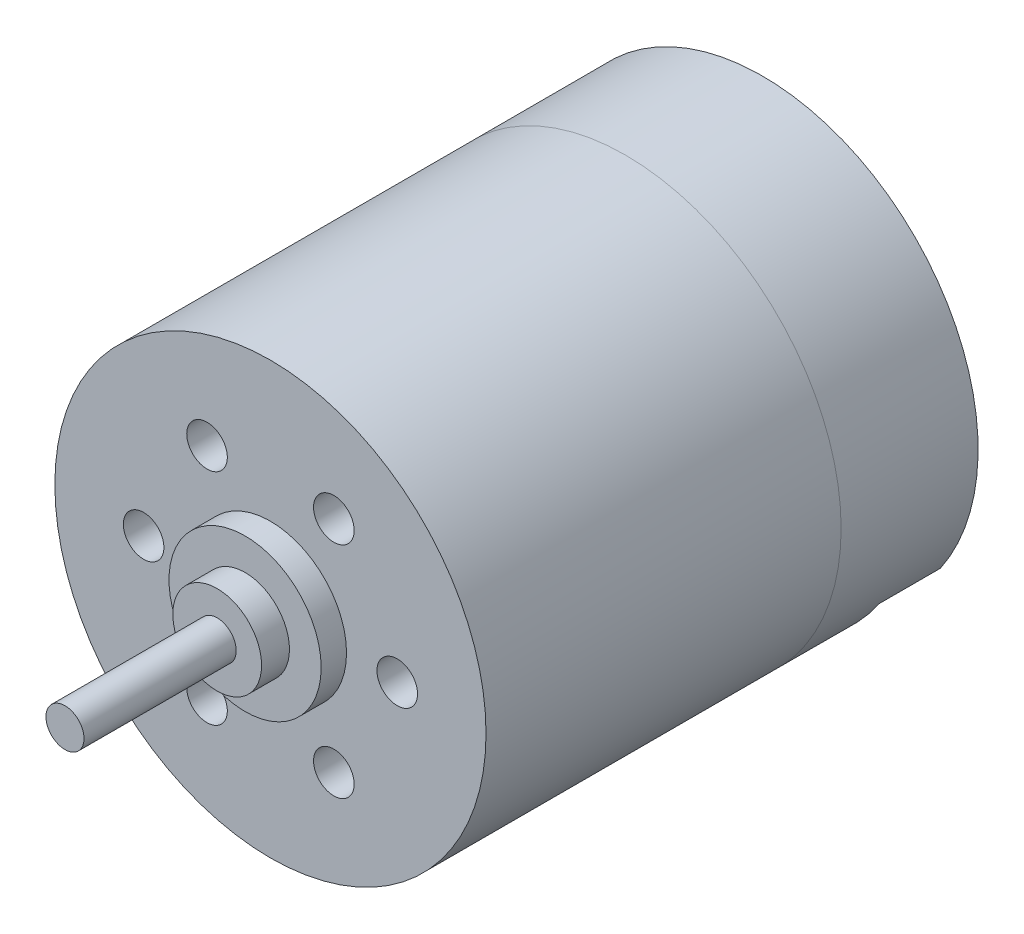
ISO-10303-21;
HEADER;
FILE_DESCRIPTION(('STEP AP214'),'2;1');
FILE_NAME('part.step','',(''),(''),'','','');
FILE_SCHEMA(('AUTOMOTIVE_DESIGN { 1 0 10303 214 1 1 1 1 }'));
ENDSEC;
DATA;
#1=APPLICATION_CONTEXT('core data for automotive mechanical design processes');
#2=APPLICATION_PROTOCOL_DEFINITION('international standard','automotive_design',2000,#1);
#3=PRODUCT_CONTEXT('',#1,'mechanical');
#4=PRODUCT('Part','Part','',(#3));
#5=PRODUCT_RELATED_PRODUCT_CATEGORY('part','',(#4));
#6=PRODUCT_DEFINITION_FORMATION('','',#4);
#7=PRODUCT_DEFINITION_CONTEXT('part definition',#1,'design');
#8=PRODUCT_DEFINITION('design','',#6,#7);
#9=PRODUCT_DEFINITION_SHAPE('','',#8);
#10=(LENGTH_UNIT() NAMED_UNIT(*) SI_UNIT(.MILLI.,.METRE.));
#11=(NAMED_UNIT(*) PLANE_ANGLE_UNIT() SI_UNIT($,.RADIAN.));
#12=(NAMED_UNIT(*) SI_UNIT($,.STERADIAN.) SOLID_ANGLE_UNIT());
#13=UNCERTAINTY_MEASURE_WITH_UNIT(LENGTH_MEASURE(1.E-05),#10,'distance_accuracy_value','');
#14=(GEOMETRIC_REPRESENTATION_CONTEXT(3) GLOBAL_UNCERTAINTY_ASSIGNED_CONTEXT((#13)) GLOBAL_UNIT_ASSIGNED_CONTEXT((#10,
#11,#12)) REPRESENTATION_CONTEXT('',''));
#15=CARTESIAN_POINT('',(0.,0.,0.));
#16=DIRECTION('',(0.,0.,1.));
#17=DIRECTION('',(1.,0.,0.));
#18=AXIS2_PLACEMENT_3D('',#15,#16,#17);
#19=CARTESIAN_POINT('',(0.,-150.80813725164,0.));
#20=DIRECTION('',(0.,0.,1.));
#21=DIRECTION('',(1.,0.,0.));
#22=AXIS2_PLACEMENT_3D('',#19,#20,#21);
#23=PLANE('',#22);
#24=DIRECTION('',(1.,0.,0.));
#25=VECTOR('',#24,1.);
#26=CARTESIAN_POINT('',(178.180592658123,-121.92,0.));
#27=LINE('',#26,#25);
#28=CARTESIAN_POINT('',(-178.180592658123,-121.92,0.));
#29=VERTEX_POINT('',#28);
#30=CARTESIAN_POINT('',(178.180592658123,-121.92,0.));
#31=VERTEX_POINT('',#30);
#32=EDGE_CURVE('P0_E41',#29,#31,#27,.T.);
#33=ORIENTED_EDGE('',*,*,#32,.T.);
#34=CARTESIAN_POINT('',(0.,0.,0.));
#35=DIRECTION('',(0.,0.,-1.));
#36=DIRECTION('',(-1.,0.,0.));
#37=AXIS2_PLACEMENT_3D('',#34,#35,#36);
#38=CIRCLE('',#37,215.9);
#39=EDGE_CURVE('P0_E20',#29,#31,#38,.F.);
#40=ORIENTED_EDGE('',*,*,#39,.F.);
#41=EDGE_LOOP('',(#33,#40));
#42=FACE_BOUND('',#41,.T.);
#43=ADVANCED_FACE('P0_F17',(#42),#23,.F.);
#44=CARTESIAN_POINT('',(178.180592658123,-121.92,-60.96));
#45=DIRECTION('',(0.,1.,0.));
#46=DIRECTION('',(0.,0.,1.));
#47=AXIS2_PLACEMENT_3D('',#44,#45,#46);
#48=PLANE('',#47);
#49=DIRECTION('',(0.,0.,-1.));
#50=VECTOR('',#49,1.);
#51=CARTESIAN_POINT('',(178.180592658123,-121.92,76.2));
#52=LINE('',#51,#50);
#53=CARTESIAN_POINT('',(178.180592658123,-121.92,-60.96));
#54=VERTEX_POINT('',#53);
#55=EDGE_CURVE('P0_E51',#31,#54,#52,.T.);
#56=ORIENTED_EDGE('',*,*,#55,.F.);
#57=ORIENTED_EDGE('',*,*,#32,.F.);
#58=DIRECTION('',(0.,0.,-1.));
#59=VECTOR('',#58,1.);
#60=CARTESIAN_POINT('',(-178.180592658123,-121.92,76.2));
#61=LINE('',#60,#59);
#62=CARTESIAN_POINT('',(-178.180592658123,-121.92,-60.96));
#63=VERTEX_POINT('',#62);
#64=EDGE_CURVE('P0_E50',#63,#29,#61,.F.);
#65=ORIENTED_EDGE('',*,*,#64,.F.);
#66=DIRECTION('',(1.,0.,0.));
#67=VECTOR('',#66,1.);
#68=CARTESIAN_POINT('',(0.,-121.92,-60.96));
#69=LINE('',#68,#67);
#70=EDGE_CURVE('P0_E35',#63,#54,#69,.T.);
#71=ORIENTED_EDGE('',*,*,#70,.T.);
#72=EDGE_LOOP('',(#56,#57,#65,#71));
#73=FACE_BOUND('',#72,.T.);
#74=ADVANCED_FACE('P0_F55',(#73),#48,.F.);
#75=CARTESIAN_POINT('',(0.,0.,-60.96));
#76=DIRECTION('',(0.,0.,1.));
#77=DIRECTION('',(1.,0.,0.));
#78=AXIS2_PLACEMENT_3D('',#75,#76,#77);
#79=PLANE('',#78);
#80=ORIENTED_EDGE('',*,*,#70,.F.);
#81=CARTESIAN_POINT('',(0.,0.,-60.96));
#82=DIRECTION('',(0.,0.,-1.));
#83=DIRECTION('',(-1.,0.,0.));
#84=AXIS2_PLACEMENT_3D('',#81,#82,#83);
#85=CIRCLE('',#84,215.9);
#86=EDGE_CURVE('P0_E26',#54,#63,#85,.F.);
#87=ORIENTED_EDGE('',*,*,#86,.F.);
#88=EDGE_LOOP('',(#80,#87));
#89=FACE_BOUND('',#88,.T.);
#90=ADVANCED_FACE('P0_F53',(#89),#79,.F.);
#91=CARTESIAN_POINT('',(0.,0.,76.2));
#92=DIRECTION('',(0.,0.,-1.));
#93=DIRECTION('',(-1.,0.,0.));
#94=AXIS2_PLACEMENT_3D('',#91,#92,#93);
#95=CYLINDRICAL_SURFACE('',#94,215.9);
#96=ORIENTED_EDGE('',*,*,#86,.T.);
#97=ORIENTED_EDGE('',*,*,#64,.T.);
#98=ORIENTED_EDGE('',*,*,#39,.T.);
#99=ORIENTED_EDGE('',*,*,#55,.T.);
#100=EDGE_LOOP('',(#96,#97,#98,#99));
#101=FACE_BOUND('',#100,.T.);
#102=CARTESIAN_POINT('',(0.,0.,76.2));
#103=DIRECTION('',(0.,0.,-1.));
#104=DIRECTION('',(-1.,0.,0.));
#105=AXIS2_PLACEMENT_3D('',#102,#103,#104);
#106=CIRCLE('',#105,215.9);
#107=CARTESIAN_POINT('',(-215.9,0.,76.2));
#108=VERTEX_POINT('',#107);
#109=EDGE_CURVE('P0_E11',#108,#108,#106,.F.);
#110=ORIENTED_EDGE('',*,*,#109,.F.);
#111=EDGE_LOOP('',(#110));
#112=FACE_BOUND('',#111,.T.);
#113=ADVANCED_FACE('P0_F47',(#101,#112),#95,.T.);
#114=CARTESIAN_POINT('',(0.,0.,76.2));
#115=DIRECTION('',(0.,0.,1.));
#116=DIRECTION('',(1.,0.,0.));
#117=AXIS2_PLACEMENT_3D('',#114,#115,#116);
#118=PLANE('',#117);
#119=ORIENTED_EDGE('',*,*,#109,.T.);
#120=EDGE_LOOP('',(#119));
#121=FACE_BOUND('',#120,.T.);
#122=ADVANCED_FACE('P0_F65',(#121),#118,.T.);
#123=CLOSED_SHELL('',(#43,#74,#90,#113,#122));
#124=MANIFOLD_SOLID_BREP('P0_B1',#123);
#125=CARTESIAN_POINT('',(0.,0.,637.54));
#126=DIRECTION('',(0.,0.,1.));
#127=DIRECTION('',(1.,0.,0.));
#128=AXIS2_PLACEMENT_3D('',#125,#126,#127);
#129=PLANE('',#128);
#130=CARTESIAN_POINT('',(0.,0.,637.54));
#131=DIRECTION('',(0.,0.,1.));
#132=DIRECTION('',(1.,0.,0.));
#133=AXIS2_PLACEMENT_3D('',#130,#131,#132);
#134=CIRCLE('',#133,19.05);
#135=CARTESIAN_POINT('',(19.05,0.,637.54));
#136=VERTEX_POINT('',#135);
#137=EDGE_CURVE('P1_E20',#136,#136,#134,.F.);
#138=ORIENTED_EDGE('',*,*,#137,.F.);
#139=EDGE_LOOP('',(#138));
#140=FACE_BOUND('',#139,.T.);
#141=ADVANCED_FACE('P1_F17',(#140),#129,.T.);
#142=CARTESIAN_POINT('',(0.,0.,485.14));
#143=DIRECTION('',(0.,0.,1.));
#144=DIRECTION('',(1.,0.,0.));
#145=AXIS2_PLACEMENT_3D('',#142,#143,#144);
#146=CYLINDRICAL_SURFACE('',#145,19.05);
#147=CARTESIAN_POINT('',(0.,0.,485.14));
#148=DIRECTION('',(0.,0.,1.));
#149=DIRECTION('',(1.,0.,0.));
#150=AXIS2_PLACEMENT_3D('',#147,#148,#149);
#151=CIRCLE('',#150,19.05);
#152=CARTESIAN_POINT('',(19.05,0.,485.14));
#153=VERTEX_POINT('',#152);
#154=EDGE_CURVE('P1_E88',#153,#153,#151,.F.);
#155=ORIENTED_EDGE('',*,*,#154,.F.);
#156=EDGE_LOOP('',(#155));
#157=FACE_BOUND('',#156,.T.);
#158=ORIENTED_EDGE('',*,*,#137,.T.);
#159=EDGE_LOOP('',(#158));
#160=FACE_BOUND('',#159,.T.);
#161=ADVANCED_FACE('P1_F95',(#157,#160),#146,.T.);
#162=CARTESIAN_POINT('',(0.,0.,485.14));
#163=DIRECTION('',(0.,0.,1.));
#164=DIRECTION('',(1.,0.,0.));
#165=AXIS2_PLACEMENT_3D('',#162,#163,#164);
#166=PLANE('',#165);
#167=ORIENTED_EDGE('',*,*,#154,.T.);
#168=EDGE_LOOP('',(#167));
#169=FACE_BOUND('',#168,.T.);
#170=CARTESIAN_POINT('',(0.,0.,485.14));
#171=DIRECTION('',(0.,0.,1.));
#172=DIRECTION('',(1.,0.,0.));
#173=AXIS2_PLACEMENT_3D('',#170,#171,#172);
#174=CIRCLE('',#173,44.45);
#175=CARTESIAN_POINT('',(44.45,0.,485.14));
#176=VERTEX_POINT('',#175);
#177=EDGE_CURVE('P1_E63',#176,#176,#174,.F.);
#178=ORIENTED_EDGE('',*,*,#177,.F.);
#179=EDGE_LOOP('',(#178));
#180=FACE_BOUND('',#179,.T.);
#181=ADVANCED_FACE('P1_F102',(#169,#180),#166,.T.);
#182=CARTESIAN_POINT('',(0.,0.,457.2));
#183=DIRECTION('',(0.,0.,1.));
#184=DIRECTION('',(1.,0.,0.));
#185=AXIS2_PLACEMENT_3D('',#182,#183,#184);
#186=CYLINDRICAL_SURFACE('',#185,44.45);
#187=CARTESIAN_POINT('',(0.,0.,457.2));
#188=DIRECTION('',(0.,0.,1.));
#189=DIRECTION('',(1.,0.,0.));
#190=AXIS2_PLACEMENT_3D('',#187,#188,#189);
#191=CIRCLE('',#190,44.45);
#192=CARTESIAN_POINT('',(44.45,0.,457.2));
#193=VERTEX_POINT('',#192);
#194=EDGE_CURVE('P1_E80',#193,#193,#191,.F.);
#195=ORIENTED_EDGE('',*,*,#194,.F.);
#196=EDGE_LOOP('',(#195));
#197=FACE_BOUND('',#196,.T.);
#198=ORIENTED_EDGE('',*,*,#177,.T.);
#199=EDGE_LOOP('',(#198));
#200=FACE_BOUND('',#199,.T.);
#201=ADVANCED_FACE('P1_F195',(#197,#200),#186,.T.);
#202=CARTESIAN_POINT('',(0.,-154.940209157209,25.4));
#203=DIRECTION('',(0.,0.,1.));
#204=DIRECTION('',(1.,0.,0.));
#205=AXIS2_PLACEMENT_3D('',#202,#203,#204);
#206=PLANE('',#205);
#207=CARTESIAN_POINT('',(0.,0.,25.4));
#208=DIRECTION('',(0.,0.,1.));
#209=DIRECTION('',(1.,0.,0.));
#210=AXIS2_PLACEMENT_3D('',#207,#208,#209);
#211=CIRCLE('',#210,201.93);
#212=CARTESIAN_POINT('',(-150.509735565511,-134.62,25.4));
#213=VERTEX_POINT('',#212);
#214=CARTESIAN_POINT('',(150.509735565511,-134.62,25.4));
#215=VERTEX_POINT('',#214);
#216=EDGE_CURVE('P1_E58',#213,#215,#211,.T.);
#217=ORIENTED_EDGE('',*,*,#216,.F.);
#218=DIRECTION('',(1.,0.,0.));
#219=VECTOR('',#218,1.);
#220=CARTESIAN_POINT('',(150.509735565511,-134.62,25.4));
#221=LINE('',#220,#219);
#222=EDGE_CURVE('P1_E54',#213,#215,#221,.T.);
#223=ORIENTED_EDGE('',*,*,#222,.T.);
#224=EDGE_LOOP('',(#217,#223));
#225=FACE_BOUND('',#224,.T.);
#226=ADVANCED_FACE('P1_F56',(#225),#206,.F.);
#227=CARTESIAN_POINT('',(150.509735565511,-134.62,0.));
#228=DIRECTION('',(0.,1.,0.));
#229=DIRECTION('',(0.,0.,1.));
#230=AXIS2_PLACEMENT_3D('',#227,#228,#229);
#231=PLANE('',#230);
#232=DIRECTION('',(0.,0.,1.));
#233=VECTOR('',#232,1.);
#234=CARTESIAN_POINT('',(150.509735565511,-134.62,0.));
#235=LINE('',#234,#233);
#236=CARTESIAN_POINT('',(150.509735565511,-134.62,0.));
#237=VERTEX_POINT('',#236);
#238=EDGE_CURVE('P1_E67',#215,#237,#235,.F.);
#239=ORIENTED_EDGE('',*,*,#238,.F.);
#240=ORIENTED_EDGE('',*,*,#222,.F.);
#241=DIRECTION('',(0.,0.,1.));
#242=VECTOR('',#241,1.);
#243=CARTESIAN_POINT('',(-150.509735565511,-134.62,0.));
#244=LINE('',#243,#242);
#245=CARTESIAN_POINT('',(-150.509735565511,-134.62,0.));
#246=VERTEX_POINT('',#245);
#247=EDGE_CURVE('P1_E78',#246,#213,#244,.T.);
#248=ORIENTED_EDGE('',*,*,#247,.F.);
#249=DIRECTION('',(1.,0.,0.));
#250=VECTOR('',#249,1.);
#251=CARTESIAN_POINT('',(0.,-134.62,0.));
#252=LINE('',#251,#250);
#253=EDGE_CURVE('P1_E70',#246,#237,#252,.T.);
#254=ORIENTED_EDGE('',*,*,#253,.T.);
#255=EDGE_LOOP('',(#239,#240,#248,#254));
#256=FACE_BOUND('',#255,.T.);
#257=ADVANCED_FACE('P1_F68',(#256),#231,.F.);
#258=CARTESIAN_POINT('',(0.,154.940209157209,25.4));
#259=DIRECTION('',(0.,0.,1.));
#260=DIRECTION('',(1.,0.,0.));
#261=AXIS2_PLACEMENT_3D('',#258,#259,#260);
#262=PLANE('',#261);
#263=CARTESIAN_POINT('',(0.,0.,25.4));
#264=DIRECTION('',(0.,0.,1.));
#265=DIRECTION('',(1.,0.,0.));
#266=AXIS2_PLACEMENT_3D('',#263,#264,#265);
#267=CIRCLE('',#266,201.93);
#268=CARTESIAN_POINT('',(150.509735565511,134.62,25.4));
#269=VERTEX_POINT('',#268);
#270=CARTESIAN_POINT('',(-150.509735565511,134.62,25.4));
#271=VERTEX_POINT('',#270);
#272=EDGE_CURVE('P1_E382',#269,#271,#267,.T.);
#273=ORIENTED_EDGE('',*,*,#272,.F.);
#274=DIRECTION('',(1.,0.,0.));
#275=VECTOR('',#274,1.);
#276=CARTESIAN_POINT('',(0.,134.62,25.4));
#277=LINE('',#276,#275);
#278=EDGE_CURVE('P1_E62',#269,#271,#277,.F.);
#279=ORIENTED_EDGE('',*,*,#278,.T.);
#280=EDGE_LOOP('',(#273,#279));
#281=FACE_BOUND('',#280,.T.);
#282=ADVANCED_FACE('P1_F187',(#281),#262,.F.);
#283=CARTESIAN_POINT('',(0.,134.62,0.));
#284=DIRECTION('',(0.,-1.,0.));
#285=DIRECTION('',(1.,0.,0.));
#286=AXIS2_PLACEMENT_3D('',#283,#284,#285);
#287=PLANE('',#286);
#288=DIRECTION('',(0.,0.,1.));
#289=VECTOR('',#288,1.);
#290=CARTESIAN_POINT('',(-150.509735565511,134.62,0.));
#291=LINE('',#290,#289);
#292=CARTESIAN_POINT('',(-150.509735565511,134.62,0.));
#293=VERTEX_POINT('',#292);
#294=EDGE_CURVE('P1_E379',#271,#293,#291,.F.);
#295=ORIENTED_EDGE('',*,*,#294,.F.);
#296=ORIENTED_EDGE('',*,*,#278,.F.);
#297=DIRECTION('',(0.,0.,1.));
#298=VECTOR('',#297,1.);
#299=CARTESIAN_POINT('',(150.509735565511,134.62,0.));
#300=LINE('',#299,#298);
#301=CARTESIAN_POINT('',(150.509735565511,134.62,0.));
#302=VERTEX_POINT('',#301);
#303=EDGE_CURVE('P1_E384',#302,#269,#300,.T.);
#304=ORIENTED_EDGE('',*,*,#303,.F.);
#305=DIRECTION('',(1.,0.,0.));
#306=VECTOR('',#305,1.);
#307=CARTESIAN_POINT('',(0.,134.62,0.));
#308=LINE('',#307,#306);
#309=EDGE_CURVE('P1_E35',#302,#293,#308,.F.);
#310=ORIENTED_EDGE('',*,*,#309,.T.);
#311=EDGE_LOOP('',(#295,#296,#304,#310));
#312=FACE_BOUND('',#311,.T.);
#313=ADVANCED_FACE('P1_F183',(#312),#287,.F.);
#314=CARTESIAN_POINT('',(0.,0.,0.));
#315=DIRECTION('',(0.,0.,1.));
#316=DIRECTION('',(1.,0.,0.));
#317=AXIS2_PLACEMENT_3D('',#314,#315,#316);
#318=PLANE('',#317);
#319=ORIENTED_EDGE('',*,*,#253,.F.);
#320=CARTESIAN_POINT('',(0.,0.,0.));
#321=DIRECTION('',(0.,0.,1.));
#322=DIRECTION('',(1.,0.,0.));
#323=AXIS2_PLACEMENT_3D('',#320,#321,#322);
#324=CIRCLE('',#323,201.93);
#325=EDGE_CURVE('P1_E374',#293,#246,#324,.T.);
#326=ORIENTED_EDGE('',*,*,#325,.F.);
#327=ORIENTED_EDGE('',*,*,#309,.F.);
#328=CARTESIAN_POINT('',(0.,0.,0.));
#329=DIRECTION('',(0.,0.,1.));
#330=DIRECTION('',(1.,0.,0.));
#331=AXIS2_PLACEMENT_3D('',#328,#329,#330);
#332=CIRCLE('',#331,201.93);
#333=EDGE_CURVE('P1_E73',#237,#302,#332,.T.);
#334=ORIENTED_EDGE('',*,*,#333,.F.);
#335=EDGE_LOOP('',(#319,#326,#327,#334));
#336=FACE_BOUND('',#335,.T.);
#337=ADVANCED_FACE('P1_F179',(#336),#318,.F.);
#338=CARTESIAN_POINT('',(0.,0.,457.2));
#339=DIRECTION('',(0.,0.,1.));
#340=DIRECTION('',(1.,0.,0.));
#341=AXIS2_PLACEMENT_3D('',#338,#339,#340);
#342=PLANE('',#341);
#343=ORIENTED_EDGE('',*,*,#194,.T.);
#344=EDGE_LOOP('',(#343));
#345=FACE_BOUND('',#344,.T.);
#346=CARTESIAN_POINT('',(0.,0.,457.2));
#347=DIRECTION('',(0.,0.,1.));
#348=DIRECTION('',(1.,0.,0.));
#349=AXIS2_PLACEMENT_3D('',#346,#347,#348);
#350=CIRCLE('',#349,76.2);
#351=CARTESIAN_POINT('',(76.2,0.,457.2));
#352=VERTEX_POINT('',#351);
#353=EDGE_CURVE('P1_E372',#352,#352,#350,.F.);
#354=ORIENTED_EDGE('',*,*,#353,.F.);
#355=EDGE_LOOP('',(#354));
#356=FACE_BOUND('',#355,.T.);
#357=ADVANCED_FACE('P1_F175',(#345,#356),#342,.T.);
#358=CARTESIAN_POINT('',(-63.5000000000001,-109.985226280624,391.16));
#359=DIRECTION('',(0.,0.,1.));
#360=DIRECTION('',(1.,0.,0.));
#361=AXIS2_PLACEMENT_3D('',#358,#359,#360);
#362=PLANE('',#361);
#363=CARTESIAN_POINT('',(-63.5,-109.985226280624,391.16));
#364=DIRECTION('',(0.,0.,-1.));
#365=DIRECTION('',(-1.,0.,0.));
#366=AXIS2_PLACEMENT_3D('',#363,#364,#365);
#367=CIRCLE('',#366,20.32);
#368=CARTESIAN_POINT('',(-83.8200000000001,-109.985226280624,391.16));
#369=VERTEX_POINT('',#368);
#370=EDGE_CURVE('P1_E373',#369,#369,#367,.F.);
#371=ORIENTED_EDGE('',*,*,#370,.T.);
#372=EDGE_LOOP('',(#371));
#373=FACE_BOUND('',#372,.T.);
#374=ADVANCED_FACE('P1_F171',(#373),#362,.T.);
#375=CARTESIAN_POINT('',(-63.4999999999999,109.985226280624,391.16));
#376=DIRECTION('',(0.,0.,1.));
#377=DIRECTION('',(1.,0.,0.));
#378=AXIS2_PLACEMENT_3D('',#375,#376,#377);
#379=PLANE('',#378);
#380=CARTESIAN_POINT('',(-63.4999999999999,109.985226280624,391.16));
#381=DIRECTION('',(0.,0.,-1.));
#382=DIRECTION('',(-1.,0.,0.));
#383=AXIS2_PLACEMENT_3D('',#380,#381,#382);
#384=CIRCLE('',#383,20.32);
#385=CARTESIAN_POINT('',(-83.8199999999999,109.985226280624,391.16));
#386=VERTEX_POINT('',#385);
#387=EDGE_CURVE('P1_E377',#386,#386,#384,.F.);
#388=ORIENTED_EDGE('',*,*,#387,.T.);
#389=EDGE_LOOP('',(#388));
#390=FACE_BOUND('',#389,.T.);
#391=ADVANCED_FACE('P1_F167',(#390),#379,.T.);
#392=CARTESIAN_POINT('',(127.,0.,391.16));
#393=DIRECTION('',(0.,0.,1.));
#394=DIRECTION('',(1.,0.,0.));
#395=AXIS2_PLACEMENT_3D('',#392,#393,#394);
#396=PLANE('',#395);
#397=CARTESIAN_POINT('',(127.,0.,391.16));
#398=DIRECTION('',(0.,0.,-1.));
#399=DIRECTION('',(-1.,0.,0.));
#400=AXIS2_PLACEMENT_3D('',#397,#398,#399);
#401=CIRCLE('',#400,20.32);
#402=CARTESIAN_POINT('',(106.68,0.,391.16));
#403=VERTEX_POINT('',#402);
#404=EDGE_CURVE('P1_E425',#403,#403,#401,.F.);
#405=ORIENTED_EDGE('',*,*,#404,.T.);
#406=EDGE_LOOP('',(#405));
#407=FACE_BOUND('',#406,.T.);
#408=ADVANCED_FACE('P1_F163',(#407),#396,.T.);
#409=CARTESIAN_POINT('',(63.5000000000001,109.985226280624,391.16));
#410=DIRECTION('',(0.,0.,1.));
#411=DIRECTION('',(1.,0.,0.));
#412=AXIS2_PLACEMENT_3D('',#409,#410,#411);
#413=PLANE('',#412);
#414=CARTESIAN_POINT('',(63.5,109.985226280624,391.16));
#415=DIRECTION('',(0.,0.,-1.));
#416=DIRECTION('',(-1.,0.,0.));
#417=AXIS2_PLACEMENT_3D('',#414,#415,#416);
#418=CIRCLE('',#417,20.32);
#419=CARTESIAN_POINT('',(43.18,109.985226280624,391.16));
#420=VERTEX_POINT('',#419);
#421=EDGE_CURVE('P1_E422',#420,#420,#418,.F.);
#422=ORIENTED_EDGE('',*,*,#421,.T.);
#423=EDGE_LOOP('',(#422));
#424=FACE_BOUND('',#423,.T.);
#425=ADVANCED_FACE('P1_F159',(#424),#413,.T.);
#426=CARTESIAN_POINT('',(-127.,0.,391.16));
#427=DIRECTION('',(0.,0.,1.));
#428=DIRECTION('',(1.,0.,0.));
#429=AXIS2_PLACEMENT_3D('',#426,#427,#428);
#430=PLANE('',#429);
#431=CARTESIAN_POINT('',(-127.,0.,391.16));
#432=DIRECTION('',(0.,0.,-1.));
#433=DIRECTION('',(-1.,0.,0.));
#434=AXIS2_PLACEMENT_3D('',#431,#432,#433);
#435=CIRCLE('',#434,20.32);
#436=CARTESIAN_POINT('',(-147.32,0.,391.16));
#437=VERTEX_POINT('',#436);
#438=EDGE_CURVE('P1_E419',#437,#437,#435,.F.);
#439=ORIENTED_EDGE('',*,*,#438,.T.);
#440=EDGE_LOOP('',(#439));
#441=FACE_BOUND('',#440,.T.);
#442=ADVANCED_FACE('P1_F155',(#441),#430,.T.);
#443=CARTESIAN_POINT('',(63.4999999999999,-109.985226280624,391.16));
#444=DIRECTION('',(0.,0.,1.));
#445=DIRECTION('',(1.,0.,0.));
#446=AXIS2_PLACEMENT_3D('',#443,#444,#445);
#447=PLANE('',#446);
#448=CARTESIAN_POINT('',(63.4999999999999,-109.985226280624,391.16));
#449=DIRECTION('',(0.,0.,-1.));
#450=DIRECTION('',(-1.,0.,0.));
#451=AXIS2_PLACEMENT_3D('',#448,#449,#450);
#452=CIRCLE('',#451,20.32);
#453=CARTESIAN_POINT('',(43.1799999999999,-109.985226280624,391.16));
#454=VERTEX_POINT('',#453);
#455=EDGE_CURVE('P1_E416',#454,#454,#452,.F.);
#456=ORIENTED_EDGE('',*,*,#455,.T.);
#457=EDGE_LOOP('',(#456));
#458=FACE_BOUND('',#457,.T.);
#459=ADVANCED_FACE('P1_F151',(#458),#447,.T.);
#460=CARTESIAN_POINT('',(0.,0.,0.));
#461=DIRECTION('',(0.,0.,1.));
#462=DIRECTION('',(1.,0.,0.));
#463=AXIS2_PLACEMENT_3D('',#460,#461,#462);
#464=CYLINDRICAL_SURFACE('',#463,201.93);
#465=CARTESIAN_POINT('',(0.,0.,76.2));
#466=DIRECTION('',(0.,0.,1.));
#467=DIRECTION('',(1.,0.,0.));
#468=AXIS2_PLACEMENT_3D('',#465,#466,#467);
#469=CIRCLE('',#468,201.93);
#470=CARTESIAN_POINT('',(201.93,0.,76.2));
#471=VERTEX_POINT('',#470);
#472=EDGE_CURVE('P1_E413',#471,#471,#469,.F.);
#473=ORIENTED_EDGE('',*,*,#472,.T.);
#474=EDGE_LOOP('',(#473));
#475=FACE_BOUND('',#474,.T.);
#476=ORIENTED_EDGE('',*,*,#294,.T.);
#477=ORIENTED_EDGE('',*,*,#325,.T.);
#478=ORIENTED_EDGE('',*,*,#247,.T.);
#479=ORIENTED_EDGE('',*,*,#216,.T.);
#480=ORIENTED_EDGE('',*,*,#238,.T.);
#481=ORIENTED_EDGE('',*,*,#333,.T.);
#482=ORIENTED_EDGE('',*,*,#303,.T.);
#483=ORIENTED_EDGE('',*,*,#272,.T.);
#484=EDGE_LOOP('',(#476,#477,#478,#479,#480,#481,#482,#483));
#485=FACE_BOUND('',#484,.T.);
#486=ADVANCED_FACE('P1_F76',(#475,#485),#464,.T.);
#487=CARTESIAN_POINT('',(0.,0.,431.8));
#488=DIRECTION('',(0.,0.,1.));
#489=DIRECTION('',(1.,0.,0.));
#490=AXIS2_PLACEMENT_3D('',#487,#488,#489);
#491=CYLINDRICAL_SURFACE('',#490,76.2);
#492=ORIENTED_EDGE('',*,*,#353,.T.);
#493=EDGE_LOOP('',(#492));
#494=FACE_BOUND('',#493,.T.);
#495=CARTESIAN_POINT('',(0.,0.,431.8));
#496=DIRECTION('',(0.,0.,1.));
#497=DIRECTION('',(1.,0.,0.));
#498=AXIS2_PLACEMENT_3D('',#495,#496,#497);
#499=CIRCLE('',#498,76.2);
#500=CARTESIAN_POINT('',(76.2,0.,431.8));
#501=VERTEX_POINT('',#500);
#502=EDGE_CURVE('P1_E410',#501,#501,#499,.F.);
#503=ORIENTED_EDGE('',*,*,#502,.F.);
#504=EDGE_LOOP('',(#503));
#505=FACE_BOUND('',#504,.T.);
#506=ADVANCED_FACE('P1_F144',(#494,#505),#491,.T.);
#507=CARTESIAN_POINT('',(-63.5,-109.985226280624,431.8));
#508=DIRECTION('',(0.,0.,-1.));
#509=DIRECTION('',(-1.,0.,0.));
#510=AXIS2_PLACEMENT_3D('',#507,#508,#509);
#511=CYLINDRICAL_SURFACE('',#510,20.32);
#512=ORIENTED_EDGE('',*,*,#370,.F.);
#513=EDGE_LOOP('',(#512));
#514=FACE_BOUND('',#513,.T.);
#515=CARTESIAN_POINT('',(-63.5,-109.985226280624,431.8));
#516=DIRECTION('',(0.,0.,-1.));
#517=DIRECTION('',(-1.,0.,0.));
#518=AXIS2_PLACEMENT_3D('',#515,#516,#517);
#519=CIRCLE('',#518,20.32);
#520=CARTESIAN_POINT('',(-83.8200000000001,-109.985226280624,431.8));
#521=VERTEX_POINT('',#520);
#522=EDGE_CURVE('P1_E407',#521,#521,#519,.T.);
#523=ORIENTED_EDGE('',*,*,#522,.F.);
#524=EDGE_LOOP('',(#523));
#525=FACE_BOUND('',#524,.T.);
#526=ADVANCED_FACE('P1_F140',(#514,#525),#511,.F.);
#527=CARTESIAN_POINT('',(-63.4999999999999,109.985226280624,431.8));
#528=DIRECTION('',(0.,0.,-1.));
#529=DIRECTION('',(-1.,0.,0.));
#530=AXIS2_PLACEMENT_3D('',#527,#528,#529);
#531=CYLINDRICAL_SURFACE('',#530,20.32);
#532=ORIENTED_EDGE('',*,*,#387,.F.);
#533=EDGE_LOOP('',(#532));
#534=FACE_BOUND('',#533,.T.);
#535=CARTESIAN_POINT('',(-63.4999999999999,109.985226280624,431.8));
#536=DIRECTION('',(0.,0.,-1.));
#537=DIRECTION('',(-1.,0.,0.));
#538=AXIS2_PLACEMENT_3D('',#535,#536,#537);
#539=CIRCLE('',#538,20.32);
#540=CARTESIAN_POINT('',(-83.8199999999999,109.985226280624,431.8));
#541=VERTEX_POINT('',#540);
#542=EDGE_CURVE('P1_E404',#541,#541,#539,.T.);
#543=ORIENTED_EDGE('',*,*,#542,.F.);
#544=EDGE_LOOP('',(#543));
#545=FACE_BOUND('',#544,.T.);
#546=ADVANCED_FACE('P1_F136',(#534,#545),#531,.F.);
#547=CARTESIAN_POINT('',(127.,0.,431.8));
#548=DIRECTION('',(0.,0.,-1.));
#549=DIRECTION('',(-1.,0.,0.));
#550=AXIS2_PLACEMENT_3D('',#547,#548,#549);
#551=CYLINDRICAL_SURFACE('',#550,20.32);
#552=ORIENTED_EDGE('',*,*,#404,.F.);
#553=EDGE_LOOP('',(#552));
#554=FACE_BOUND('',#553,.T.);
#555=CARTESIAN_POINT('',(127.,0.,431.8));
#556=DIRECTION('',(0.,0.,-1.));
#557=DIRECTION('',(-1.,0.,0.));
#558=AXIS2_PLACEMENT_3D('',#555,#556,#557);
#559=CIRCLE('',#558,20.32);
#560=CARTESIAN_POINT('',(106.68,0.,431.8));
#561=VERTEX_POINT('',#560);
#562=EDGE_CURVE('P1_E401',#561,#561,#559,.T.);
#563=ORIENTED_EDGE('',*,*,#562,.F.);
#564=EDGE_LOOP('',(#563));
#565=FACE_BOUND('',#564,.T.);
#566=ADVANCED_FACE('P1_F132',(#554,#565),#551,.F.);
#567=CARTESIAN_POINT('',(63.5,109.985226280624,431.8));
#568=DIRECTION('',(0.,0.,-1.));
#569=DIRECTION('',(-1.,0.,0.));
#570=AXIS2_PLACEMENT_3D('',#567,#568,#569);
#571=CYLINDRICAL_SURFACE('',#570,20.32);
#572=ORIENTED_EDGE('',*,*,#421,.F.);
#573=EDGE_LOOP('',(#572));
#574=FACE_BOUND('',#573,.T.);
#575=CARTESIAN_POINT('',(63.5,109.985226280624,431.8));
#576=DIRECTION('',(0.,0.,-1.));
#577=DIRECTION('',(-1.,0.,0.));
#578=AXIS2_PLACEMENT_3D('',#575,#576,#577);
#579=CIRCLE('',#578,20.32);
#580=CARTESIAN_POINT('',(43.18,109.985226280624,431.8));
#581=VERTEX_POINT('',#580);
#582=EDGE_CURVE('P1_E398',#581,#581,#579,.T.);
#583=ORIENTED_EDGE('',*,*,#582,.F.);
#584=EDGE_LOOP('',(#583));
#585=FACE_BOUND('',#584,.T.);
#586=ADVANCED_FACE('P1_F128',(#574,#585),#571,.F.);
#587=CARTESIAN_POINT('',(-127.,0.,431.8));
#588=DIRECTION('',(0.,0.,-1.));
#589=DIRECTION('',(-1.,0.,0.));
#590=AXIS2_PLACEMENT_3D('',#587,#588,#589);
#591=CYLINDRICAL_SURFACE('',#590,20.32);
#592=ORIENTED_EDGE('',*,*,#438,.F.);
#593=EDGE_LOOP('',(#592));
#594=FACE_BOUND('',#593,.T.);
#595=CARTESIAN_POINT('',(-127.,0.,431.8));
#596=DIRECTION('',(0.,0.,-1.));
#597=DIRECTION('',(-1.,0.,0.));
#598=AXIS2_PLACEMENT_3D('',#595,#596,#597);
#599=CIRCLE('',#598,20.32);
#600=CARTESIAN_POINT('',(-147.32,0.,431.8));
#601=VERTEX_POINT('',#600);
#602=EDGE_CURVE('P1_E395',#601,#601,#599,.T.);
#603=ORIENTED_EDGE('',*,*,#602,.F.);
#604=EDGE_LOOP('',(#603));
#605=FACE_BOUND('',#604,.T.);
#606=ADVANCED_FACE('P1_F124',(#594,#605),#591,.F.);
#607=CARTESIAN_POINT('',(63.4999999999999,-109.985226280624,431.8));
#608=DIRECTION('',(0.,0.,-1.));
#609=DIRECTION('',(-1.,0.,0.));
#610=AXIS2_PLACEMENT_3D('',#607,#608,#609);
#611=CYLINDRICAL_SURFACE('',#610,20.32);
#612=ORIENTED_EDGE('',*,*,#455,.F.);
#613=EDGE_LOOP('',(#612));
#614=FACE_BOUND('',#613,.T.);
#615=CARTESIAN_POINT('',(63.4999999999999,-109.985226280624,431.8));
#616=DIRECTION('',(0.,0.,-1.));
#617=DIRECTION('',(-1.,0.,0.));
#618=AXIS2_PLACEMENT_3D('',#615,#616,#617);
#619=CIRCLE('',#618,20.32);
#620=CARTESIAN_POINT('',(43.1799999999999,-109.985226280624,431.8));
#621=VERTEX_POINT('',#620);
#622=EDGE_CURVE('P1_E392',#621,#621,#619,.T.);
#623=ORIENTED_EDGE('',*,*,#622,.F.);
#624=EDGE_LOOP('',(#623));
#625=FACE_BOUND('',#624,.T.);
#626=ADVANCED_FACE('P1_F120',(#614,#625),#611,.F.);
#627=CARTESIAN_POINT('',(0.,0.,76.2));
#628=DIRECTION('',(0.,0.,1.));
#629=DIRECTION('',(1.,0.,0.));
#630=AXIS2_PLACEMENT_3D('',#627,#628,#629);
#631=PLANE('',#630);
#632=CARTESIAN_POINT('',(0.,0.,76.2));
#633=DIRECTION('',(0.,0.,1.));
#634=DIRECTION('',(1.,0.,0.));
#635=AXIS2_PLACEMENT_3D('',#632,#633,#634);
#636=CIRCLE('',#635,215.9);
#637=CARTESIAN_POINT('',(215.9,0.,76.2));
#638=VERTEX_POINT('',#637);
#639=EDGE_CURVE('P1_E26',#638,#638,#636,.T.);
#640=ORIENTED_EDGE('',*,*,#639,.F.);
#641=EDGE_LOOP('',(#640));
#642=FACE_BOUND('',#641,.T.);
#643=ORIENTED_EDGE('',*,*,#472,.F.);
#644=EDGE_LOOP('',(#643));
#645=FACE_BOUND('',#644,.T.);
#646=ADVANCED_FACE('P1_F112',(#642,#645),#631,.F.);
#647=CARTESIAN_POINT('',(0.,0.,431.8));
#648=DIRECTION('',(0.,0.,1.));
#649=DIRECTION('',(1.,0.,0.));
#650=AXIS2_PLACEMENT_3D('',#647,#648,#649);
#651=PLANE('',#650);
#652=CARTESIAN_POINT('',(0.,0.,431.8));
#653=DIRECTION('',(0.,0.,1.));
#654=DIRECTION('',(1.,0.,0.));
#655=AXIS2_PLACEMENT_3D('',#652,#653,#654);
#656=CIRCLE('',#655,215.9);
#657=CARTESIAN_POINT('',(215.9,0.,431.8));
#658=VERTEX_POINT('',#657);
#659=EDGE_CURVE('P1_E11',#658,#658,#656,.F.);
#660=ORIENTED_EDGE('',*,*,#659,.F.);
#661=EDGE_LOOP('',(#660));
#662=FACE_BOUND('',#661,.T.);
#663=ORIENTED_EDGE('',*,*,#622,.T.);
#664=EDGE_LOOP('',(#663));
#665=FACE_BOUND('',#664,.T.);
#666=ORIENTED_EDGE('',*,*,#602,.T.);
#667=EDGE_LOOP('',(#666));
#668=FACE_BOUND('',#667,.T.);
#669=ORIENTED_EDGE('',*,*,#582,.T.);
#670=EDGE_LOOP('',(#669));
#671=FACE_BOUND('',#670,.T.);
#672=ORIENTED_EDGE('',*,*,#562,.T.);
#673=EDGE_LOOP('',(#672));
#674=FACE_BOUND('',#673,.T.);
#675=ORIENTED_EDGE('',*,*,#542,.T.);
#676=EDGE_LOOP('',(#675));
#677=FACE_BOUND('',#676,.T.);
#678=ORIENTED_EDGE('',*,*,#522,.T.);
#679=EDGE_LOOP('',(#678));
#680=FACE_BOUND('',#679,.T.);
#681=ORIENTED_EDGE('',*,*,#502,.T.);
#682=EDGE_LOOP('',(#681));
#683=FACE_BOUND('',#682,.T.);
#684=ADVANCED_FACE('P1_F106',(#662,#665,#668,#671,#674,#677,#680,#683),#651,.T.);
#685=CARTESIAN_POINT('',(0.,0.,76.2));
#686=DIRECTION('',(0.,0.,1.));
#687=DIRECTION('',(1.,0.,0.));
#688=AXIS2_PLACEMENT_3D('',#685,#686,#687);
#689=CYLINDRICAL_SURFACE('',#688,215.9);
#690=ORIENTED_EDGE('',*,*,#639,.T.);
#691=EDGE_LOOP('',(#690));
#692=FACE_BOUND('',#691,.T.);
#693=ORIENTED_EDGE('',*,*,#659,.T.);
#694=EDGE_LOOP('',(#693));
#695=FACE_BOUND('',#694,.T.);
#696=ADVANCED_FACE('P1_F104',(#692,#695),#689,.T.);
#697=CLOSED_SHELL('',(#141,#161,#181,#201,#226,#257,#282,#313,#337,#357,#374,#391,#408,#425,
#442,#459,#486,#506,#526,#546,#566,#586,#606,#626,#646,#684,#696));
#698=MANIFOLD_SOLID_BREP('P1_B1',#697);
#699=ADVANCED_BREP_SHAPE_REPRESENTATION('',(#18,#124,#698),#14);
#700=SHAPE_DEFINITION_REPRESENTATION(#9,#699);
ENDSEC;
END-ISO-10303-21;
